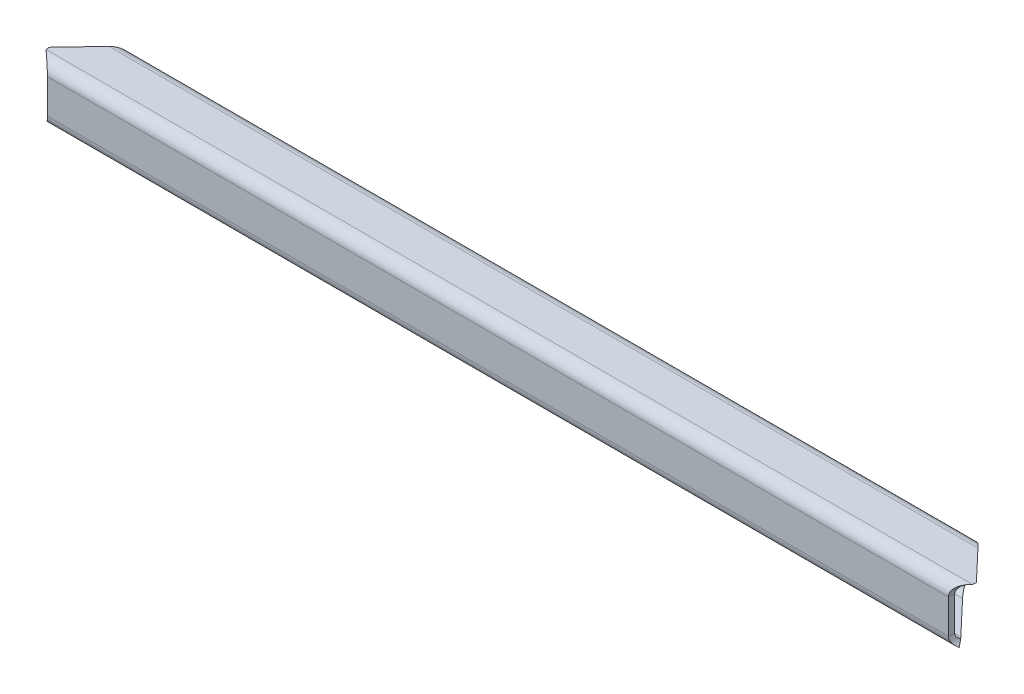
ISO-10303-21;
HEADER;
FILE_DESCRIPTION(('STEP AP214'),'2;1');
FILE_NAME('part.step','',(''),(''),'','','');
FILE_SCHEMA(('AUTOMOTIVE_DESIGN { 1 0 10303 214 1 1 1 1 }'));
ENDSEC;
DATA;
#1=APPLICATION_CONTEXT('core data for automotive mechanical design processes');
#2=APPLICATION_PROTOCOL_DEFINITION('international standard','automotive_design',2000,#1);
#3=PRODUCT_CONTEXT('',#1,'mechanical');
#4=PRODUCT('Part','Part','',(#3));
#5=PRODUCT_RELATED_PRODUCT_CATEGORY('part','',(#4));
#6=PRODUCT_DEFINITION_FORMATION('','',#4);
#7=PRODUCT_DEFINITION_CONTEXT('part definition',#1,'design');
#8=PRODUCT_DEFINITION('design','',#6,#7);
#9=PRODUCT_DEFINITION_SHAPE('','',#8);
#10=(LENGTH_UNIT() NAMED_UNIT(*) SI_UNIT(.MILLI.,.METRE.));
#11=(NAMED_UNIT(*) PLANE_ANGLE_UNIT() SI_UNIT($,.RADIAN.));
#12=(NAMED_UNIT(*) SI_UNIT($,.STERADIAN.) SOLID_ANGLE_UNIT());
#13=UNCERTAINTY_MEASURE_WITH_UNIT(LENGTH_MEASURE(1.E-05),#10,'distance_accuracy_value','');
#14=(GEOMETRIC_REPRESENTATION_CONTEXT(3) GLOBAL_UNCERTAINTY_ASSIGNED_CONTEXT((#13)) GLOBAL_UNIT_ASSIGNED_CONTEXT((#10,
#11,#12)) REPRESENTATION_CONTEXT('',''));
#15=CARTESIAN_POINT('',(0.,0.,0.));
#16=DIRECTION('',(0.,0.,1.));
#17=DIRECTION('',(1.,0.,0.));
#18=AXIS2_PLACEMENT_3D('',#15,#16,#17);
#19=CARTESIAN_POINT('',(-169.428571428572,6.00000000000006,-988.999999999999));
#20=DIRECTION('',(1.,0.,0.));
#21=DIRECTION('',(0.,1.,0.));
#22=AXIS2_PLACEMENT_3D('',#19,#20,#21);
#23=CYLINDRICAL_SURFACE('',#22,2.);
#24=DIRECTION('',(1.,0.,0.));
#25=VECTOR('',#24,1.);
#26=CARTESIAN_POINT('',(-169.428571428572,8.00000000000006,-988.999999999999));
#27=LINE('',#26,#25);
#28=CARTESIAN_POINT('',(-159.217149659244,8.00000000000007,-988.999999999999));
#29=VERTEX_POINT('',#28);
#30=CARTESIAN_POINT('',(159.217149659243,8.,-988.999999999999));
#31=VERTEX_POINT('',#30);
#32=EDGE_CURVE('E214',#29,#31,#27,.T.);
#33=ORIENTED_EDGE('',*,*,#32,.T.);
#34=CARTESIAN_POINT('',(159.217149659243,8.00000000000001,-988.999999999999));
#35=CARTESIAN_POINT('',(159.210922036057,8.00000378393458,-988.945406885648));
#36=CARTESIAN_POINT('',(159.203392434487,7.99776384499151,-988.891001318183));
#37=CARTESIAN_POINT('',(159.185931601539,7.98892816990646,-988.782982141156));
#38=CARTESIAN_POINT('',(159.176002517134,7.98233631861945,-988.729367868822));
#39=CARTESIAN_POINT('',(159.143054453386,7.95634679249622,-988.570939663102));
#40=CARTESIAN_POINT('',(159.116781055866,7.93073112342423,-988.46775974092));
#41=CARTESIAN_POINT('',(159.058106425898,7.86447463934079,-988.268747825726));
#42=CARTESIAN_POINT('',(159.025724912408,7.82388178311721,-988.172893545041));
#43=CARTESIAN_POINT('',(158.957406831272,7.72897970022321,-987.989397197336));
#44=CARTESIAN_POINT('',(158.921463341127,7.67464343298085,-987.901771792465));
#45=CARTESIAN_POINT('',(158.844772257884,7.54683348559491,-987.727108083443));
#46=CARTESIAN_POINT('',(158.803925812453,7.47192488699679,-987.641160157541));
#47=CARTESIAN_POINT('',(158.724640427903,7.30792031092203,-987.482651275367));
#48=CARTESIAN_POINT('',(158.686202065033,7.21882095555204,-987.410093515319));
#49=CARTESIAN_POINT('',(158.6138996549,7.02450247551815,-987.278182494708));
#50=CARTESIAN_POINT('',(158.580241836201,6.91882961331509,-987.219377859785));
#51=CARTESIAN_POINT('',(158.522907915932,6.69643482158755,-987.121261378399));
#52=CARTESIAN_POINT('',(158.499205718591,6.57974277278537,-987.081898522654));
#53=CARTESIAN_POINT('',(158.471261785977,6.38492708419047,-987.035888652455));
#54=CARTESIAN_POINT('',(158.463050361591,6.30890768281359,-987.022498798001));
#55=CARTESIAN_POINT('',(158.451987757356,6.15528943209417,-987.004527352016));
#56=CARTESIAN_POINT('',(158.449148243345,6.07768751437327,-986.999964929974));
#57=CARTESIAN_POINT('',(158.449191454966,6.00000000000002,-986.999999999999));
#58=B_SPLINE_CURVE_WITH_KNOTS('',3,(#34,#35,#36,#37,#38,#39,#40,#41,#42,#43,#44,#45,#46,#47,#48,
#49,#50,#51,#52,#53,#54,#55,#56,#57),.UNSPECIFIED.,.F.,.F.,(4,2,2,2,2,2,2,2,2,2,2,4),(0.,
0.16471101897179,0.329275202545901,0.656079435740069,0.981846157426087,1.3082588897137,
1.67000621123648,2.03183977024398,2.40628968364467,2.77975186590453,3.01197263852517,
3.2446971339819),.UNSPECIFIED.);
#59=CARTESIAN_POINT('',(158.449191454966,6.00000000000001,-986.999999999999));
#60=VERTEX_POINT('',#59);
#61=EDGE_CURVE('E206',#31,#60,#58,.T.);
#62=ORIENTED_EDGE('',*,*,#61,.T.);
#63=DIRECTION('',(1.,0.,0.));
#64=VECTOR('',#63,1.);
#65=CARTESIAN_POINT('',(-169.428571428572,6.00000000000006,-986.999999999999));
#66=LINE('',#65,#64);
#67=CARTESIAN_POINT('',(-158.449191454967,6.00000000000001,-986.999999999999));
#68=VERTEX_POINT('',#67);
#69=EDGE_CURVE('E205',#68,#60,#66,.T.);
#70=ORIENTED_EDGE('',*,*,#69,.F.);
#71=CARTESIAN_POINT('',(-158.449191454967,6.00000000000006,-986.999999999999));
#72=CARTESIAN_POINT('',(-158.449181088276,6.05113742808683,-986.999990535802));
#73=CARTESIAN_POINT('',(-158.450402327418,6.10226783241757,-987.001960976797));
#74=CARTESIAN_POINT('',(-158.455229693472,6.2040912196785,-987.009788260993));
#75=CARTESIAN_POINT('',(-158.458834586163,6.25478441523527,-987.015643092918));
#76=CARTESIAN_POINT('',(-158.468324317597,6.35508084646132,-987.031122228539));
#77=CARTESIAN_POINT('',(-158.474196216591,6.4046886094124,-987.040725142068));
#78=CARTESIAN_POINT('',(-158.488072956633,6.50274559223832,-987.063563989516));
#79=CARTESIAN_POINT('',(-158.496077980952,6.55119471217593,-987.076800235605));
#80=CARTESIAN_POINT('',(-158.523003161242,6.69415310098741,-987.121678123007));
#81=CARTESIAN_POINT('',(-158.544859715153,6.78653658239981,-987.158530525804));
#82=CARTESIAN_POINT('',(-158.594636768432,6.96356396029479,-987.244644739539));
#83=CARTESIAN_POINT('',(-158.622564711204,7.0481981737032,-987.293921794812));
#84=CARTESIAN_POINT('',(-158.684812116677,7.21461903273111,-987.407637146317));
#85=CARTESIAN_POINT('',(-158.719458164608,7.29568444487854,-987.472950777637));
#86=CARTESIAN_POINT('',(-158.790975793571,7.4463160643107,-987.614759188322));
#87=CARTESIAN_POINT('',(-158.827849632759,7.51587032726013,-987.691265428378));
#88=CARTESIAN_POINT('',(-158.906101179419,7.650888326548,-987.865002629685));
#89=CARTESIAN_POINT('',(-158.947428350028,7.71458924226298,-987.963636448079));
#90=CARTESIAN_POINT('',(-159.025631273784,7.82421637946442,-988.171730918346));
#91=CARTESIAN_POINT('',(-159.062515946805,7.87017864109292,-988.281169044241));
#92=CARTESIAN_POINT('',(-159.122781949741,7.93671697031144,-988.490861591138));
#93=CARTESIAN_POINT('',(-159.147375305335,7.9601524851641,-988.589844741756));
#94=CARTESIAN_POINT('',(-159.178288730932,7.98389361504185,-988.741523087992));
#95=CARTESIAN_POINT('',(-159.187614480217,7.98990596963515,-988.792762164494));
#96=CARTESIAN_POINT('',(-159.204073133516,7.99796272194639,-988.895944878289));
#97=CARTESIAN_POINT('',(-159.211204099335,8.00000362091969,-988.947889096268));
#98=CARTESIAN_POINT('',(-159.217149659244,8.00000000000006,-988.999999999999));
#99=B_SPLINE_CURVE_WITH_KNOTS('',3,(#71,#72,#73,#74,#75,#76,#77,#78,#79,#80,#81,#82,#83,#84,#85,
#86,#87,#88,#89,#90,#91,#92,#93,#94,#95,#96,#97,#98),.UNSPECIFIED.,.F.,.F.,(4,2,2,2,2,2,2,2,2,2,
2,2,2,4),(0.,0.153348192858811,0.306617046356498,0.459023697128475,0.611443446464379,
0.915489952029175,1.21991133611073,1.54777651151418,1.87597978577068,2.24766582338126,
2.61859266940544,2.93105522595561,3.08815493067804,3.24539297343133),.UNSPECIFIED.);
#100=EDGE_CURVE('E279',#68,#29,#99,.T.);
#101=ORIENTED_EDGE('',*,*,#100,.T.);
#102=EDGE_LOOP('',(#33,#62,#70,#101));
#103=FACE_BOUND('',#102,.T.);
#104=ADVANCED_FACE('F41',(#103),#23,.F.);
#105=CARTESIAN_POINT('',(-169.428571428572,6.00000000000006,-988.999999999999));
#106=DIRECTION('',(1.,0.,0.));
#107=DIRECTION('',(0.,1.,0.));
#108=AXIS2_PLACEMENT_3D('',#105,#106,#107);
#109=CYLINDRICAL_SURFACE('',#108,4.);
#110=CARTESIAN_POINT('',(162.703800587265,6.00000000000001,-988.999999999999));
#111=DIRECTION('',(0.665752735195008,0.,0.74617243019316));
#112=DIRECTION('',(0.74617243019316,0.,-0.665752735195008));
#113=AXIS2_PLACEMENT_3D('',#110,#111,#112);
#114=ELLIPSE('',#113,6.00823667487953,4.);
#115=CARTESIAN_POINT('',(162.703800587265,10.,-988.999999999999));
#116=VERTEX_POINT('',#115);
#117=CARTESIAN_POINT('',(158.220620026395,6.00000000000001,-984.999999999999));
#118=VERTEX_POINT('',#117);
#119=EDGE_CURVE('E397',#116,#118,#114,.T.);
#120=ORIENTED_EDGE('',*,*,#119,.F.);
#121=DIRECTION('',(1.,0.,0.));
#122=VECTOR('',#121,1.);
#123=CARTESIAN_POINT('',(-169.428571428572,10.0000000000001,-988.999999999999));
#124=LINE('',#123,#122);
#125=CARTESIAN_POINT('',(-162.703800587266,10.,-988.999999999999));
#126=VERTEX_POINT('',#125);
#127=EDGE_CURVE('E230',#126,#116,#124,.T.);
#128=ORIENTED_EDGE('',*,*,#127,.F.);
#129=CARTESIAN_POINT('',(-162.703800587266,6.00000000000003,-988.999999999999));
#130=DIRECTION('',(0.665752735195008,0.,-0.74617243019316));
#131=DIRECTION('',(0.74617243019316,0.,0.665752735195008));
#132=AXIS2_PLACEMENT_3D('',#129,#130,#131);
#133=ELLIPSE('',#132,6.00823667487953,4.);
#134=CARTESIAN_POINT('',(-158.220620026395,6.00000000000001,-984.999999999999));
#135=VERTEX_POINT('',#134);
#136=EDGE_CURVE('E288',#135,#126,#133,.F.);
#137=ORIENTED_EDGE('',*,*,#136,.F.);
#138=DIRECTION('',(1.,0.,0.));
#139=VECTOR('',#138,1.);
#140=CARTESIAN_POINT('',(-169.428571428572,6.00000000000006,-984.999999999999));
#141=LINE('',#140,#139);
#142=EDGE_CURVE('E225',#135,#118,#141,.T.);
#143=ORIENTED_EDGE('',*,*,#142,.T.);
#144=EDGE_LOOP('',(#120,#128,#137,#143));
#145=FACE_BOUND('',#144,.T.);
#146=ADVANCED_FACE('F312',(#145),#109,.T.);
#147=CARTESIAN_POINT('',(-169.428571428572,-5.99999999999995,-988.999999999999));
#148=DIRECTION('',(1.,0.,0.));
#149=DIRECTION('',(0.,1.,0.));
#150=AXIS2_PLACEMENT_3D('',#147,#148,#149);
#151=CYLINDRICAL_SURFACE('',#150,4.);
#152=CARTESIAN_POINT('',(162.703800587265,-6.00000000000001,-988.999999999999));
#153=DIRECTION('',(0.665752735195008,0.,0.74617243019316));
#154=DIRECTION('',(0.74617243019316,0.,-0.665752735195008));
#155=AXIS2_PLACEMENT_3D('',#152,#153,#154);
#156=ELLIPSE('',#155,6.00823667487953,4.);
#157=CARTESIAN_POINT('',(158.220620026395,-6.00000000000001,-984.999999999999));
#158=VERTEX_POINT('',#157);
#159=CARTESIAN_POINT('',(160.266092160077,-9.35700111931669,-986.825018739182));
#160=VERTEX_POINT('',#159);
#161=EDGE_CURVE('E56',#158,#160,#156,.T.);
#162=ORIENTED_EDGE('',*,*,#161,.F.);
#163=DIRECTION('',(1.,0.,0.));
#164=VECTOR('',#163,1.);
#165=CARTESIAN_POINT('',(-169.428571428572,-5.99999999999995,-984.999999999999));
#166=LINE('',#165,#164);
#167=CARTESIAN_POINT('',(-158.220620026395,-6.00000000000001,-984.999999999999));
#168=VERTEX_POINT('',#167);
#169=EDGE_CURVE('E470',#168,#158,#166,.T.);
#170=ORIENTED_EDGE('',*,*,#169,.F.);
#171=CARTESIAN_POINT('',(-162.703800587266,-5.99999999999998,-988.999999999999));
#172=DIRECTION('',(0.665752735195008,0.,-0.74617243019316));
#173=DIRECTION('',(0.74617243019316,0.,0.665752735195008));
#174=AXIS2_PLACEMENT_3D('',#171,#172,#173);
#175=ELLIPSE('',#174,6.00823667487953,4.);
#176=CARTESIAN_POINT('',(-160.266092160077,-9.35700111931662,-986.825018739182));
#177=VERTEX_POINT('',#176);
#178=EDGE_CURVE('E229',#177,#168,#175,.F.);
#179=ORIENTED_EDGE('',*,*,#178,.F.);
#180=CARTESIAN_POINT('',(-159.210703215174,-5.99999999999995,-988.999999999999));
#181=DIRECTION('',(-0.708778209555371,-0.212903658810695,-0.672536602516548));
#182=DIRECTION('',(0.705431392595681,-0.213913749350422,-0.675727354914216));
#183=AXIS2_PLACEMENT_3D('',#180,#181,#182);
#184=ELLIPSE('',#183,5.6435143548068,4.);
#185=CARTESIAN_POINT('',(-158.009178360485,-9.99999999999996,-988.999999999999));
#186=VERTEX_POINT('',#185);
#187=EDGE_CURVE('E446',#186,#177,#184,.T.);
#188=ORIENTED_EDGE('',*,*,#187,.F.);
#189=DIRECTION('',(1.,0.,0.));
#190=VECTOR('',#189,1.);
#191=CARTESIAN_POINT('',(-169.428571428572,-9.99999999999996,-988.999999999999));
#192=LINE('',#191,#190);
#193=CARTESIAN_POINT('',(158.009178360484,-10.,-988.999999999999));
#194=VERTEX_POINT('',#193);
#195=EDGE_CURVE('E246',#186,#194,#192,.T.);
#196=ORIENTED_EDGE('',*,*,#195,.T.);
#197=CARTESIAN_POINT('',(159.210703215174,-6.,-988.999999999999));
#198=DIRECTION('',(0.708778209555372,-0.212903658810694,-0.672536602516547));
#199=DIRECTION('',(0.70543139259568,0.213913749350422,0.675727354914217));
#200=AXIS2_PLACEMENT_3D('',#197,#198,#199);
#201=ELLIPSE('',#200,5.6435143548068,4.);
#202=EDGE_CURVE('E237',#160,#194,#201,.T.);
#203=ORIENTED_EDGE('',*,*,#202,.F.);
#204=EDGE_LOOP('',(#162,#170,#179,#188,#196,#203));
#205=FACE_BOUND('',#204,.T.);
#206=ADVANCED_FACE('F241',(#205),#151,.T.);
#207=CARTESIAN_POINT('',(-169.428571428572,8.00000000000006,-988.999999999999));
#208=DIRECTION('',(0.,-1.,0.));
#209=DIRECTION('',(1.,0.,0.));
#210=AXIS2_PLACEMENT_3D('',#207,#208,#209);
#211=PLANE('',#210);
#212=DIRECTION('',(0.688317522845565,0.,0.725409531053836));
#213=VECTOR('',#212,1.);
#214=CARTESIAN_POINT('',(5.72058318204074,8.00000000000003,-1155.19333916792));
#215=LINE('',#214,#213);
#216=CARTESIAN_POINT('',(152.02963029528,8.00000000000001,-1001.));
#217=VERTEX_POINT('',#216);
#218=CARTESIAN_POINT('',(159.668517535762,8.,-992.949468919542));
#219=VERTEX_POINT('',#218);
#220=EDGE_CURVE('E252',#217,#219,#215,.T.);
#221=ORIENTED_EDGE('',*,*,#220,.T.);
#222=DIRECTION('',(-0.113546591160732,0.,0.993532672656404));
#223=VECTOR('',#222,1.);
#224=CARTESIAN_POINT('',(240.59710582802,8.,-1701.0746164768));
#225=LINE('',#224,#223);
#226=EDGE_CURVE('E11',#219,#31,#225,.T.);
#227=ORIENTED_EDGE('',*,*,#226,.T.);
#228=ORIENTED_EDGE('',*,*,#32,.F.);
#229=DIRECTION('',(0.113546591160732,0.,0.993532672656404));
#230=VECTOR('',#229,1.);
#231=CARTESIAN_POINT('',(-240.597105828021,8.00000000000007,-1701.0746164768));
#232=LINE('',#231,#230);
#233=CARTESIAN_POINT('',(-159.668517535763,8.00000000000006,-992.949468919542));
#234=VERTEX_POINT('',#233);
#235=EDGE_CURVE('E276',#29,#234,#232,.F.);
#236=ORIENTED_EDGE('',*,*,#235,.T.);
#237=DIRECTION('',(0.688317522845566,0.,-0.725409531053835));
#238=VECTOR('',#237,1.);
#239=CARTESIAN_POINT('',(-166.26466333516,8.00000000000006,-985.99787046056));
#240=LINE('',#239,#238);
#241=CARTESIAN_POINT('',(-152.02963029528,8.00000000000006,-1001.));
#242=VERTEX_POINT('',#241);
#243=EDGE_CURVE('E453',#234,#242,#240,.T.);
#244=ORIENTED_EDGE('',*,*,#243,.T.);
#245=DIRECTION('',(1.,0.,0.));
#246=VECTOR('',#245,1.);
#247=CARTESIAN_POINT('',(-169.428571428572,8.00000000000006,-1001.));
#248=LINE('',#247,#246);
#249=EDGE_CURVE('E223',#242,#217,#248,.T.);
#250=ORIENTED_EDGE('',*,*,#249,.T.);
#251=EDGE_LOOP('',(#221,#227,#228,#236,#244,#250));
#252=FACE_BOUND('',#251,.T.);
#253=ADVANCED_FACE('F311',(#252),#211,.T.);
#254=CARTESIAN_POINT('',(-169.428571428572,-5.99999999999995,-988.999999999999));
#255=DIRECTION('',(1.,0.,0.));
#256=DIRECTION('',(0.,1.,0.));
#257=AXIS2_PLACEMENT_3D('',#254,#255,#256);
#258=CYLINDRICAL_SURFACE('',#257,2.);
#259=DIRECTION('',(1.,0.,0.));
#260=VECTOR('',#259,1.);
#261=CARTESIAN_POINT('',(-169.428571428572,-5.99999999999995,-986.999999999999));
#262=LINE('',#261,#260);
#263=CARTESIAN_POINT('',(-158.449191454967,-6.00000000000001,-986.999999999999));
#264=VERTEX_POINT('',#263);
#265=CARTESIAN_POINT('',(158.449191454966,-6.00000000000001,-986.999999999999));
#266=VERTEX_POINT('',#265);
#267=EDGE_CURVE('E203',#264,#266,#262,.T.);
#268=ORIENTED_EDGE('',*,*,#267,.T.);
#269=CARTESIAN_POINT('',(158.449191454966,-6.,-986.999999999999));
#270=CARTESIAN_POINT('',(158.449181088276,-6.05113742808677,-986.999990535802));
#271=CARTESIAN_POINT('',(158.450402327418,-6.10226783241751,-987.001960976797));
#272=CARTESIAN_POINT('',(158.455229693472,-6.20409121967844,-987.009788260993));
#273=CARTESIAN_POINT('',(158.458834586163,-6.2547844152352,-987.015643092918));
#274=CARTESIAN_POINT('',(158.468324317596,-6.35508084646126,-987.031122228539));
#275=CARTESIAN_POINT('',(158.474196216591,-6.40468860941234,-987.040725142068));
#276=CARTESIAN_POINT('',(158.488072956632,-6.50274559223825,-987.063563989516));
#277=CARTESIAN_POINT('',(158.496077980952,-6.55119471217587,-987.076800235605));
#278=CARTESIAN_POINT('',(158.523003161242,-6.69415310098735,-987.121678123007));
#279=CARTESIAN_POINT('',(158.544859715153,-6.78653658239976,-987.158530525804));
#280=CARTESIAN_POINT('',(158.594636768432,-6.96356396029473,-987.244644739539));
#281=CARTESIAN_POINT('',(158.622564711203,-7.04819817370313,-987.293921794812));
#282=CARTESIAN_POINT('',(158.684812116677,-7.21461903273104,-987.407637146317));
#283=CARTESIAN_POINT('',(158.719458164608,-7.29568444487849,-987.472950777637));
#284=CARTESIAN_POINT('',(158.790975793571,-7.44631606431064,-987.614759188321));
#285=CARTESIAN_POINT('',(158.827849632759,-7.51587032726003,-987.691265428378));
#286=CARTESIAN_POINT('',(158.906101179418,-7.65088832654791,-987.865002629685));
#287=CARTESIAN_POINT('',(158.947428350028,-7.71458924226295,-987.963636448079));
#288=CARTESIAN_POINT('',(159.025631273784,-7.82421637946441,-988.171730918347));
#289=CARTESIAN_POINT('',(159.062515946805,-7.87017864109288,-988.281169044241));
#290=CARTESIAN_POINT('',(159.12278194974,-7.93671697031138,-988.490861591138));
#291=CARTESIAN_POINT('',(159.147375305335,-7.96015248516403,-988.589844741756));
#292=CARTESIAN_POINT('',(159.178288730932,-7.98389361504178,-988.741523087992));
#293=CARTESIAN_POINT('',(159.187614480216,-7.98990596963509,-988.792762164494));
#294=CARTESIAN_POINT('',(159.204073133515,-7.99796272194633,-988.895944878288));
#295=CARTESIAN_POINT('',(159.211204099334,-8.00000362091964,-988.947889096268));
#296=CARTESIAN_POINT('',(159.217149659243,-8.00000000000001,-988.999999999999));
#297=B_SPLINE_CURVE_WITH_KNOTS('',3,(#269,#270,#271,#272,#273,#274,#275,#276,#277,#278,#279,
#280,#281,#282,#283,#284,#285,#286,#287,#288,#289,#290,#291,#292,#293,#294,#295,#296),
.UNSPECIFIED.,.F.,.F.,(4,2,2,2,2,2,2,2,2,2,2,2,2,4),(0.,0.153348192858805,0.306617046356487,
0.459023697128464,0.611443446464375,0.915489952029179,1.21991133611072,1.5477765115141,
1.87597978577063,2.24766582338138,2.61859266940543,2.93105522595549,3.08815493067792,
3.24539297343121),.UNSPECIFIED.);
#298=CARTESIAN_POINT('',(159.119747295865,-7.93232822804912,-988.484143799993));
#299=VERTEX_POINT('',#298);
#300=EDGE_CURVE('E179',#266,#299,#297,.T.);
#301=ORIENTED_EDGE('',*,*,#300,.T.);
#302=CARTESIAN_POINT('',(159.210703215174,-6.,-988.999999999999));
#303=DIRECTION('',(0.708778209555372,-0.212903658810694,-0.672536602516547));
#304=DIRECTION('',(0.70543139259568,0.213913749350422,0.675727354914217));
#305=AXIS2_PLACEMENT_3D('',#302,#303,#304);
#306=ELLIPSE('',#305,2.8217571774034,2.);
#307=CARTESIAN_POINT('',(158.609940787829,-8.,-988.999999999999));
#308=VERTEX_POINT('',#307);
#309=EDGE_CURVE('E239',#299,#308,#306,.T.);
#310=ORIENTED_EDGE('',*,*,#309,.T.);
#311=DIRECTION('',(1.,0.,0.));
#312=VECTOR('',#311,1.);
#313=CARTESIAN_POINT('',(-169.428571428572,-7.99999999999995,-988.999999999999));
#314=LINE('',#313,#312);
#315=CARTESIAN_POINT('',(-158.609940787829,-7.99999999999995,-988.999999999999));
#316=VERTEX_POINT('',#315);
#317=EDGE_CURVE('E212',#316,#308,#314,.T.);
#318=ORIENTED_EDGE('',*,*,#317,.F.);
#319=CARTESIAN_POINT('',(-159.210703215174,-5.99999999999995,-988.999999999999));
#320=DIRECTION('',(-0.708778209555371,-0.212903658810695,-0.672536602516548));
#321=DIRECTION('',(0.705431392595681,-0.213913749350422,-0.675727354914216));
#322=AXIS2_PLACEMENT_3D('',#319,#320,#321);
#323=ELLIPSE('',#322,2.8217571774034,2.);
#324=CARTESIAN_POINT('',(-159.119747295866,-7.93232822804906,-988.484143799993));
#325=VERTEX_POINT('',#324);
#326=EDGE_CURVE('E442',#316,#325,#323,.T.);
#327=ORIENTED_EDGE('',*,*,#326,.T.);
#328=CARTESIAN_POINT('',(-159.217149659243,-7.99999999999996,-988.999999999999));
#329=CARTESIAN_POINT('',(-159.210922036058,-8.00000378393452,-988.945406885648));
#330=CARTESIAN_POINT('',(-159.203392434487,-7.99776384499145,-988.891001318183));
#331=CARTESIAN_POINT('',(-159.18593160154,-7.98892816990639,-988.782982141156));
#332=CARTESIAN_POINT('',(-159.176002517134,-7.98233631861938,-988.729367868822));
#333=CARTESIAN_POINT('',(-159.143054453387,-7.95634679249614,-988.570939663102));
#334=CARTESIAN_POINT('',(-159.116781055866,-7.93073112342415,-988.46775974092));
#335=CARTESIAN_POINT('',(-159.058106425898,-7.86447463934071,-988.268747825726));
#336=CARTESIAN_POINT('',(-159.025724912408,-7.82388178311714,-988.17289354504));
#337=CARTESIAN_POINT('',(-158.957406831272,-7.72897970022314,-987.989397197336));
#338=CARTESIAN_POINT('',(-158.921463341127,-7.67464343298075,-987.901771792465));
#339=CARTESIAN_POINT('',(-158.844772257884,-7.54683348559479,-987.727108083443));
#340=CARTESIAN_POINT('',(-158.803925812454,-7.47192488699667,-987.641160157541));
#341=CARTESIAN_POINT('',(-158.724640427903,-7.3079203109219,-987.482651275367));
#342=CARTESIAN_POINT('',(-158.686202065033,-7.21882095555189,-987.410093515319));
#343=CARTESIAN_POINT('',(-158.6138996549,-7.02450247551799,-987.278182494708));
#344=CARTESIAN_POINT('',(-158.580241836201,-6.91882961331495,-987.219377859785));
#345=CARTESIAN_POINT('',(-158.522907915932,-6.69643482158741,-987.121261378399));
#346=CARTESIAN_POINT('',(-158.499205718591,-6.57974277278519,-987.081898522654));
#347=CARTESIAN_POINT('',(-158.471261785978,-6.38492708419029,-987.035888652455));
#348=CARTESIAN_POINT('',(-158.463050361591,-6.30890768281345,-987.022498798001));
#349=CARTESIAN_POINT('',(-158.451987757356,-6.15528943209409,-987.004527352016));
#350=CARTESIAN_POINT('',(-158.449148243345,-6.07768751437322,-986.999964929974));
#351=CARTESIAN_POINT('',(-158.449191454967,-6.00000000000001,-986.999999999999));
#352=B_SPLINE_CURVE_WITH_KNOTS('',3,(#328,#329,#330,#331,#332,#333,#334,#335,#336,#337,#338,
#339,#340,#341,#342,#343,#344,#345,#346,#347,#348,#349,#350,#351),.UNSPECIFIED.,.F.,.F.,(4,2,2,
2,2,2,2,2,2,2,2,4),(0.,0.16471101897192,0.329275202545922,0.656079435740094,0.981846157426003,
1.30825888971375,1.67000621123642,2.03183977024397,2.40628968364461,2.77975186590455,
3.0119726385251,3.24469713398173),.UNSPECIFIED.);
#353=EDGE_CURVE('E211',#325,#264,#352,.T.);
#354=ORIENTED_EDGE('',*,*,#353,.T.);
#355=EDGE_LOOP('',(#268,#301,#310,#318,#327,#354));
#356=FACE_BOUND('',#355,.T.);
#357=ADVANCED_FACE('F209',(#356),#258,.F.);
#358=CARTESIAN_POINT('',(-244.038803964062,-6.00000000000001,-1700.68127954697));
#359=DIRECTION('',(0.113546591160732,0.,0.993532672656404));
#360=DIRECTION('',(0.993532672656404,0.,-0.113546591160732));
#361=AXIS2_PLACEMENT_3D('',#358,#359,#360);
#362=CYLINDRICAL_SURFACE('',#361,4.);
#363=CARTESIAN_POINT('',(-162.328303315894,-6.00000000000001,-985.714398875496));
#364=DIRECTION('',(-0.708778209555371,-0.212903658810695,-0.672536602516548));
#365=DIRECTION('',(-0.629148245586715,-0.240432271061151,0.739164939717473));
#366=AXIS2_PLACEMENT_3D('',#363,#364,#365);
#367=ELLIPSE('',#366,5.34283333451752,4.);
#368=EDGE_CURVE('E445',#177,#325,#367,.F.);
#369=ORIENTED_EDGE('',*,*,#368,.F.);
#370=ORIENTED_EDGE('',*,*,#178,.T.);
#371=DIRECTION('',(0.113546591160732,0.,0.993532672656404));
#372=VECTOR('',#371,1.);
#373=CARTESIAN_POINT('',(-240.064673273436,-6.00000000000001,-1701.13546591161));
#374=LINE('',#373,#372);
#375=EDGE_CURVE('E267',#264,#168,#374,.T.);
#376=ORIENTED_EDGE('',*,*,#375,.F.);
#377=ORIENTED_EDGE('',*,*,#353,.F.);
#378=EDGE_LOOP('',(#369,#370,#376,#377));
#379=FACE_BOUND('',#378,.T.);
#380=ADVANCED_FACE('F350',(#379),#362,.F.);
#381=CARTESIAN_POINT('',(-240.064673273436,-6.00000000000001,-1701.13546591161));
#382=DIRECTION('',(-0.993532672656404,0.,0.113546591160732));
#383=DIRECTION('',(0.113546591160732,0.,0.993532672656404));
#384=AXIS2_PLACEMENT_3D('',#381,#382,#383);
#385=PLANE('',#384);
#386=DIRECTION('',(0.,1.,0.));
#387=VECTOR('',#386,1.);
#388=CARTESIAN_POINT('',(-158.220620026395,6.00000000000006,-984.999999999999));
#389=LINE('',#388,#387);
#390=EDGE_CURVE('E486',#168,#135,#389,.T.);
#391=ORIENTED_EDGE('',*,*,#390,.T.);
#392=DIRECTION('',(0.113546591160732,0.,0.993532672656404));
#393=VECTOR('',#392,1.);
#394=CARTESIAN_POINT('',(-240.064673273436,6.00000000000001,-1701.13546591161));
#395=LINE('',#394,#393);
#396=EDGE_CURVE('E270',#68,#135,#395,.T.);
#397=ORIENTED_EDGE('',*,*,#396,.F.);
#398=DIRECTION('',(0.,1.,0.));
#399=VECTOR('',#398,1.);
#400=CARTESIAN_POINT('',(-158.449191454967,6.00000000000006,-986.999999999999));
#401=LINE('',#400,#399);
#402=EDGE_CURVE('E485',#264,#68,#401,.T.);
#403=ORIENTED_EDGE('',*,*,#402,.F.);
#404=ORIENTED_EDGE('',*,*,#375,.T.);
#405=EDGE_LOOP('',(#391,#397,#403,#404));
#406=FACE_BOUND('',#405,.T.);
#407=ADVANCED_FACE('F300',(#406),#385,.T.);
#408=CARTESIAN_POINT('',(-161.063367380154,7.19515108731862,-991.224663980651));
#409=DIRECTION('',(-0.708778209555371,-0.212903658810695,-0.672536602516548));
#410=DIRECTION('',(-0.688317522845566,0.,0.725409531053835));
#411=AXIS2_PLACEMENT_3D('',#408,#409,#410);
#412=PLANE('',#411);
#413=DIRECTION('',(0.287682820424566,-0.957725740926162,0.));
#414=VECTOR('',#413,1.);
#415=CARTESIAN_POINT('',(-146.130942176686,0.998170150367917,-1005.));
#416=LINE('',#415,#414);
#417=CARTESIAN_POINT('',(-147.6333978975,6.00000000000006,-1005.));
#418=VERTEX_POINT('',#417);
#419=CARTESIAN_POINT('',(-144.028823333433,-5.99999999999996,-1005.));
#420=VERTEX_POINT('',#419);
#421=EDGE_CURVE('E419',#418,#420,#416,.T.);
#422=ORIENTED_EDGE('',*,*,#421,.T.);
#423=CARTESIAN_POINT('',(-147.824293303868,-5.99999999999996,-1001.));
#424=DIRECTION('',(-0.708778209555371,-0.212903658810695,-0.672536602516548));
#425=DIRECTION('',(0.705431392595681,-0.213913749350422,-0.675727354914216));
#426=AXIS2_PLACEMENT_3D('',#423,#424,#425);
#427=ELLIPSE('',#426,5.6435143548068,4.);
#428=CARTESIAN_POINT('',(-146.622768449179,-9.99999999999996,-1001.));
#429=VERTEX_POINT('',#428);
#430=EDGE_CURVE('E465',#420,#429,#427,.T.);
#431=ORIENTED_EDGE('',*,*,#430,.T.);
#432=DIRECTION('',(-0.688317522845566,0.,0.725409531053835));
#433=VECTOR('',#432,1.);
#434=CARTESIAN_POINT('',(-157.427724870072,-9.99999999999996,-989.612786816853));
#435=LINE('',#434,#433);
#436=EDGE_CURVE('E463',#429,#186,#435,.T.);
#437=ORIENTED_EDGE('',*,*,#436,.T.);
#438=ORIENTED_EDGE('',*,*,#187,.T.);
#439=ORIENTED_EDGE('',*,*,#368,.T.);
#440=ORIENTED_EDGE('',*,*,#326,.F.);
#441=DIRECTION('',(-0.688317522845566,0.,0.725409531053835));
#442=VECTOR('',#441,1.);
#443=CARTESIAN_POINT('',(-157.743857466464,-7.99999999999995,-989.912754760924));
#444=LINE('',#443,#442);
#445=CARTESIAN_POINT('',(-147.223530876524,-7.99999999999996,-1001.));
#446=VERTEX_POINT('',#445);
#447=EDGE_CURVE('E439',#446,#316,#444,.T.);
#448=ORIENTED_EDGE('',*,*,#447,.F.);
#449=CARTESIAN_POINT('',(-147.824293303868,-5.99999999999996,-1001.));
#450=DIRECTION('',(-0.708778209555371,-0.212903658810695,-0.672536602516548));
#451=DIRECTION('',(0.705431392595681,-0.213913749350422,-0.675727354914216));
#452=AXIS2_PLACEMENT_3D('',#449,#450,#451);
#453=ELLIPSE('',#452,2.8217571774034,2.);
#454=CARTESIAN_POINT('',(-145.926558318651,-6.00000000000001,-1003.));
#455=VERTEX_POINT('',#454);
#456=EDGE_CURVE('E438',#455,#446,#453,.T.);
#457=ORIENTED_EDGE('',*,*,#456,.F.);
#458=DIRECTION('',(0.287682820424566,-0.957725740926162,0.));
#459=VECTOR('',#458,1.);
#460=CARTESIAN_POINT('',(-147.871617947891,0.47530384960329,-1003.));
#461=LINE('',#460,#459);
#462=CARTESIAN_POINT('',(-149.531132882718,6.00000000000006,-1003.));
#463=VERTEX_POINT('',#462);
#464=EDGE_CURVE('E458',#463,#455,#461,.T.);
#465=ORIENTED_EDGE('',*,*,#464,.F.);
#466=CARTESIAN_POINT('',(-151.428867867936,6.00000000000006,-1001.));
#467=DIRECTION('',(-0.708778209555371,-0.212903658810695,-0.672536602516548));
#468=DIRECTION('',(0.705431392595681,-0.213913749350422,-0.675727354914216));
#469=AXIS2_PLACEMENT_3D('',#466,#467,#468);
#470=ELLIPSE('',#469,2.8217571774034,2.);
#471=EDGE_CURVE('E455',#242,#463,#470,.T.);
#472=ORIENTED_EDGE('',*,*,#471,.F.);
#473=ORIENTED_EDGE('',*,*,#243,.F.);
#474=CARTESIAN_POINT('',(-162.715784044051,6.00000000000001,-989.104855246875));
#475=DIRECTION('',(-0.708778209555371,-0.212903658810695,-0.672536602516548));
#476=DIRECTION('',(-0.629148245586715,-0.240432271061151,0.739164939717473));
#477=AXIS2_PLACEMENT_3D('',#474,#475,#476);
#478=ELLIPSE('',#477,5.34283333451752,4.);
#479=CARTESIAN_POINT('',(-162.844944286771,10.,-990.235007370667));
#480=VERTEX_POINT('',#479);
#481=EDGE_CURVE('E226',#234,#480,#478,.F.);
#482=ORIENTED_EDGE('',*,*,#481,.T.);
#483=DIRECTION('',(0.688317522845566,0.,-0.725409531053835));
#484=VECTOR('',#483,1.);
#485=CARTESIAN_POINT('',(-166.580795931552,10.0000000000001,-986.29783840463));
#486=LINE('',#485,#484);
#487=CARTESIAN_POINT('',(-152.630392722625,10.0000000000001,-1001.));
#488=VERTEX_POINT('',#487);
#489=EDGE_CURVE('E451',#480,#488,#486,.T.);
#490=ORIENTED_EDGE('',*,*,#489,.T.);
#491=CARTESIAN_POINT('',(-151.428867867936,6.00000000000006,-1001.));
#492=DIRECTION('',(-0.708778209555371,-0.212903658810695,-0.672536602516548));
#493=DIRECTION('',(0.705431392595681,-0.213913749350422,-0.675727354914216));
#494=AXIS2_PLACEMENT_3D('',#491,#492,#493);
#495=ELLIPSE('',#494,5.6435143548068,4.);
#496=EDGE_CURVE('E447',#488,#418,#495,.T.);
#497=ORIENTED_EDGE('',*,*,#496,.T.);
#498=EDGE_LOOP('',(#422,#431,#437,#438,#439,#440,#448,#457,#465,#472,#473,#482,#490,#497));
#499=FACE_BOUND('',#498,.T.);
#500=ADVANCED_FACE('F298',(#499),#412,.T.);
#501=CARTESIAN_POINT('',(-244.038803964062,6.00000000000001,-1700.68127954697));
#502=DIRECTION('',(0.113546591160732,0.,0.993532672656404));
#503=DIRECTION('',(0.993532672656404,0.,-0.113546591160732));
#504=AXIS2_PLACEMENT_3D('',#501,#502,#503);
#505=CYLINDRICAL_SURFACE('',#504,4.);
#506=ORIENTED_EDGE('',*,*,#136,.T.);
#507=DIRECTION('',(0.113546591160732,0.,0.993532672656404));
#508=VECTOR('',#507,1.);
#509=CARTESIAN_POINT('',(-244.038803964062,10.,-1700.68127954697));
#510=LINE('',#509,#508);
#511=EDGE_CURVE('E273',#480,#126,#510,.T.);
#512=ORIENTED_EDGE('',*,*,#511,.F.);
#513=ORIENTED_EDGE('',*,*,#481,.F.);
#514=ORIENTED_EDGE('',*,*,#235,.F.);
#515=ORIENTED_EDGE('',*,*,#100,.F.);
#516=ORIENTED_EDGE('',*,*,#396,.T.);
#517=EDGE_LOOP('',(#506,#512,#513,#514,#515,#516));
#518=FACE_BOUND('',#517,.T.);
#519=ADVANCED_FACE('F292',(#518),#505,.F.);
#520=CARTESIAN_POINT('',(-169.428571428572,-5.99999999999995,-1001.));
#521=DIRECTION('',(1.,0.,0.));
#522=DIRECTION('',(0.,1.,0.));
#523=AXIS2_PLACEMENT_3D('',#520,#521,#522);
#524=CYLINDRICAL_SURFACE('',#523,2.);
#525=DIRECTION('',(1.,0.,0.));
#526=VECTOR('',#525,1.);
#527=CARTESIAN_POINT('',(-169.428571428572,-7.99999999999995,-1001.));
#528=LINE('',#527,#526);
#529=CARTESIAN_POINT('',(147.223530876524,-8.,-1001.));
#530=VERTEX_POINT('',#529);
#531=EDGE_CURVE('E217',#446,#530,#528,.T.);
#532=ORIENTED_EDGE('',*,*,#531,.T.);
#533=CARTESIAN_POINT('',(147.824293303868,-6.,-1001.));
#534=DIRECTION('',(0.708778209555372,-0.212903658810694,-0.672536602516547));
#535=DIRECTION('',(0.70543139259568,0.213913749350422,0.675727354914217));
#536=AXIS2_PLACEMENT_3D('',#533,#534,#535);
#537=ELLIPSE('',#536,2.8217571774034,2.);
#538=CARTESIAN_POINT('',(145.92655831865,-6.00000000000027,-1003.));
#539=VERTEX_POINT('',#538);
#540=EDGE_CURVE('E261',#530,#539,#537,.T.);
#541=ORIENTED_EDGE('',*,*,#540,.T.);
#542=DIRECTION('',(1.,0.,0.));
#543=VECTOR('',#542,1.);
#544=CARTESIAN_POINT('',(-169.428571428572,-5.99999999999995,-1003.));
#545=LINE('',#544,#543);
#546=EDGE_CURVE('E432',#455,#539,#545,.T.);
#547=ORIENTED_EDGE('',*,*,#546,.F.);
#548=ORIENTED_EDGE('',*,*,#456,.T.);
#549=EDGE_LOOP('',(#532,#541,#547,#548));
#550=FACE_BOUND('',#549,.T.);
#551=ADVANCED_FACE('F297',(#550),#524,.F.);
#552=CARTESIAN_POINT('',(-169.428571428572,-5.99999999999995,-1001.));
#553=DIRECTION('',(1.,0.,0.));
#554=DIRECTION('',(0.,1.,0.));
#555=AXIS2_PLACEMENT_3D('',#552,#553,#554);
#556=CYLINDRICAL_SURFACE('',#555,4.);
#557=CARTESIAN_POINT('',(147.824293303868,-6.,-1001.));
#558=DIRECTION('',(0.708778209555372,-0.212903658810694,-0.672536602516547));
#559=DIRECTION('',(0.70543139259568,0.213913749350422,0.675727354914217));
#560=AXIS2_PLACEMENT_3D('',#557,#558,#559);
#561=ELLIPSE('',#560,5.6435143548068,4.);
#562=CARTESIAN_POINT('',(146.622768449179,-10.,-1001.));
#563=VERTEX_POINT('',#562);
#564=CARTESIAN_POINT('',(144.028823333433,-6.00000000000027,-1005.));
#565=VERTEX_POINT('',#564);
#566=EDGE_CURVE('E249',#563,#565,#561,.T.);
#567=ORIENTED_EDGE('',*,*,#566,.F.);
#568=DIRECTION('',(1.,0.,0.));
#569=VECTOR('',#568,1.);
#570=CARTESIAN_POINT('',(-169.428571428572,-9.99999999999996,-1001.));
#571=LINE('',#570,#569);
#572=EDGE_CURVE('E424',#429,#563,#571,.T.);
#573=ORIENTED_EDGE('',*,*,#572,.F.);
#574=ORIENTED_EDGE('',*,*,#430,.F.);
#575=DIRECTION('',(1.,0.,0.));
#576=VECTOR('',#575,1.);
#577=CARTESIAN_POINT('',(-169.428571428572,-5.99999999999995,-1005.));
#578=LINE('',#577,#576);
#579=EDGE_CURVE('E421',#420,#565,#578,.T.);
#580=ORIENTED_EDGE('',*,*,#579,.T.);
#581=EDGE_LOOP('',(#567,#573,#574,#580));
#582=FACE_BOUND('',#581,.T.);
#583=ADVANCED_FACE('F319',(#582),#556,.T.);
#584=CARTESIAN_POINT('',(-169.428571428572,6.00000000000006,-986.999999999999));
#585=DIRECTION('',(0.,0.,-1.));
#586=DIRECTION('',(-1.,0.,0.));
#587=AXIS2_PLACEMENT_3D('',#584,#585,#586);
#588=PLANE('',#587);
#589=ORIENTED_EDGE('',*,*,#69,.T.);
#590=DIRECTION('',(0.,-1.,0.));
#591=VECTOR('',#590,1.);
#592=CARTESIAN_POINT('',(158.449191454966,6.00000000000006,-986.999999999999));
#593=LINE('',#592,#591);
#594=EDGE_CURVE('E192',#60,#266,#593,.T.);
#595=ORIENTED_EDGE('',*,*,#594,.T.);
#596=ORIENTED_EDGE('',*,*,#267,.F.);
#597=ORIENTED_EDGE('',*,*,#402,.T.);
#598=EDGE_LOOP('',(#589,#595,#596,#597));
#599=FACE_BOUND('',#598,.T.);
#600=ADVANCED_FACE('F201',(#599),#588,.T.);
#601=CARTESIAN_POINT('',(-169.428571428572,6.00000000000006,-984.999999999999));
#602=DIRECTION('',(0.,0.,-1.));
#603=DIRECTION('',(-1.,0.,0.));
#604=AXIS2_PLACEMENT_3D('',#601,#602,#603);
#605=PLANE('',#604);
#606=DIRECTION('',(0.,-1.,0.));
#607=VECTOR('',#606,1.);
#608=CARTESIAN_POINT('',(158.220620026395,6.00000000000006,-984.999999999999));
#609=LINE('',#608,#607);
#610=EDGE_CURVE('E195',#118,#158,#609,.T.);
#611=ORIENTED_EDGE('',*,*,#610,.F.);
#612=ORIENTED_EDGE('',*,*,#142,.F.);
#613=ORIENTED_EDGE('',*,*,#390,.F.);
#614=ORIENTED_EDGE('',*,*,#169,.T.);
#615=EDGE_LOOP('',(#611,#612,#613,#614));
#616=FACE_BOUND('',#615,.T.);
#617=ADVANCED_FACE('F305',(#616),#605,.F.);
#618=CARTESIAN_POINT('',(-169.428571428572,6.00000000000006,-1001.));
#619=DIRECTION('',(1.,0.,0.));
#620=DIRECTION('',(0.,1.,0.));
#621=AXIS2_PLACEMENT_3D('',#618,#619,#620);
#622=CYLINDRICAL_SURFACE('',#621,2.);
#623=DIRECTION('',(1.,0.,0.));
#624=VECTOR('',#623,1.);
#625=CARTESIAN_POINT('',(-169.428571428572,6.00000000000006,-1003.));
#626=LINE('',#625,#624);
#627=CARTESIAN_POINT('',(149.531132882718,6.00000000000001,-1003.));
#628=VERTEX_POINT('',#627);
#629=EDGE_CURVE('E430',#463,#628,#626,.T.);
#630=ORIENTED_EDGE('',*,*,#629,.T.);
#631=CARTESIAN_POINT('',(151.428867867935,6.00000000000001,-1001.));
#632=DIRECTION('',(0.708778209555372,-0.212903658810694,-0.672536602516547));
#633=DIRECTION('',(0.70543139259568,0.213913749350422,0.675727354914217));
#634=AXIS2_PLACEMENT_3D('',#631,#632,#633);
#635=ELLIPSE('',#634,2.8217571774034,2.);
#636=EDGE_CURVE('E64',#628,#217,#635,.T.);
#637=ORIENTED_EDGE('',*,*,#636,.T.);
#638=ORIENTED_EDGE('',*,*,#249,.F.);
#639=ORIENTED_EDGE('',*,*,#471,.T.);
#640=EDGE_LOOP('',(#630,#637,#638,#639));
#641=FACE_BOUND('',#640,.T.);
#642=ADVANCED_FACE('F43',(#641),#622,.F.);
#643=CARTESIAN_POINT('',(-169.428571428572,10.0000000000001,-988.999999999999));
#644=DIRECTION('',(0.,-1.,0.));
#645=DIRECTION('',(1.,0.,0.));
#646=AXIS2_PLACEMENT_3D('',#643,#644,#645);
#647=PLANE('',#646);
#648=ORIENTED_EDGE('',*,*,#127,.T.);
#649=DIRECTION('',(-0.113546591160732,0.,0.993532672656404));
#650=VECTOR('',#649,1.);
#651=CARTESIAN_POINT('',(244.038803964062,10.,-1700.68127954696));
#652=LINE('',#651,#650);
#653=CARTESIAN_POINT('',(162.84494428677,10.,-990.235007370667));
#654=VERTEX_POINT('',#653);
#655=EDGE_CURVE('E478',#654,#116,#652,.T.);
#656=ORIENTED_EDGE('',*,*,#655,.F.);
#657=DIRECTION('',(0.688317522845565,0.,0.725409531053836));
#658=VECTOR('',#657,1.);
#659=CARTESIAN_POINT('',(6.03671577843246,10.,-1155.49330711199));
#660=LINE('',#659,#658);
#661=CARTESIAN_POINT('',(152.630392722624,10.,-1001.));
#662=VERTEX_POINT('',#661);
#663=EDGE_CURVE('E247',#662,#654,#660,.T.);
#664=ORIENTED_EDGE('',*,*,#663,.F.);
#665=DIRECTION('',(1.,0.,0.));
#666=VECTOR('',#665,1.);
#667=CARTESIAN_POINT('',(-169.428571428572,10.0000000000001,-1001.));
#668=LINE('',#667,#666);
#669=EDGE_CURVE('E416',#488,#662,#668,.T.);
#670=ORIENTED_EDGE('',*,*,#669,.F.);
#671=ORIENTED_EDGE('',*,*,#489,.F.);
#672=ORIENTED_EDGE('',*,*,#511,.T.);
#673=EDGE_LOOP('',(#648,#656,#664,#670,#671,#672));
#674=FACE_BOUND('',#673,.T.);
#675=ADVANCED_FACE('F330',(#674),#647,.F.);
#676=CARTESIAN_POINT('',(-169.428571428572,6.00000000000006,-1001.));
#677=DIRECTION('',(1.,0.,0.));
#678=DIRECTION('',(0.,1.,0.));
#679=AXIS2_PLACEMENT_3D('',#676,#677,#678);
#680=CYLINDRICAL_SURFACE('',#679,4.);
#681=CARTESIAN_POINT('',(151.428867867935,6.00000000000001,-1001.));
#682=DIRECTION('',(0.708778209555372,-0.212903658810694,-0.672536602516547));
#683=DIRECTION('',(0.70543139259568,0.213913749350422,0.675727354914217));
#684=AXIS2_PLACEMENT_3D('',#681,#682,#683);
#685=ELLIPSE('',#684,5.6435143548068,4.);
#686=CARTESIAN_POINT('',(147.6333978975,6.00000000000001,-1005.));
#687=VERTEX_POINT('',#686);
#688=EDGE_CURVE('E399',#687,#662,#685,.T.);
#689=ORIENTED_EDGE('',*,*,#688,.F.);
#690=DIRECTION('',(1.,0.,0.));
#691=VECTOR('',#690,1.);
#692=CARTESIAN_POINT('',(-169.428571428572,6.00000000000006,-1005.));
#693=LINE('',#692,#691);
#694=EDGE_CURVE('E414',#418,#687,#693,.T.);
#695=ORIENTED_EDGE('',*,*,#694,.F.);
#696=ORIENTED_EDGE('',*,*,#496,.F.);
#697=ORIENTED_EDGE('',*,*,#669,.T.);
#698=EDGE_LOOP('',(#689,#695,#696,#697));
#699=FACE_BOUND('',#698,.T.);
#700=ADVANCED_FACE('F327',(#699),#680,.T.);
#701=CARTESIAN_POINT('',(163.618211285882,-2.9370779111048,-985.324603969017));
#702=DIRECTION('',(0.708778209555372,-0.212903658810694,-0.672536602516547));
#703=DIRECTION('',(-0.688317522845565,0.,-0.725409531053836));
#704=AXIS2_PLACEMENT_3D('',#701,#702,#703);
#705=PLANE('',#704);
#706=DIRECTION('',(-0.688317522845565,0.,-0.725409531053836));
#707=VECTOR('',#706,1.);
#708=CARTESIAN_POINT('',(-2.80022268665542,-7.99999999999998,-1159.10822346828));
#709=LINE('',#708,#707);
#710=EDGE_CURVE('E264',#308,#530,#709,.T.);
#711=ORIENTED_EDGE('',*,*,#710,.F.);
#712=ORIENTED_EDGE('',*,*,#309,.F.);
#713=CARTESIAN_POINT('',(162.328303315894,-6.00000000000001,-985.714398875496));
#714=DIRECTION('',(0.708778209555372,-0.212903658810694,-0.672536602516547));
#715=DIRECTION('',(0.629148245586714,-0.24043227106115,0.739164939717474));
#716=AXIS2_PLACEMENT_3D('',#713,#714,#715);
#717=ELLIPSE('',#716,5.34283333451752,4.);
#718=EDGE_CURVE('E49',#299,#160,#717,.F.);
#719=ORIENTED_EDGE('',*,*,#718,.T.);
#720=ORIENTED_EDGE('',*,*,#202,.T.);
#721=DIRECTION('',(-0.688317522845565,0.,-0.725409531053836));
#722=VECTOR('',#721,1.);
#723=CARTESIAN_POINT('',(-3.11635528304713,-9.99999999999998,-1158.80825552421));
#724=LINE('',#723,#722);
#725=EDGE_CURVE('E257',#194,#563,#724,.T.);
#726=ORIENTED_EDGE('',*,*,#725,.T.);
#727=ORIENTED_EDGE('',*,*,#566,.T.);
#728=DIRECTION('',(0.287682820424565,0.957725740926163,0.));
#729=VECTOR('',#728,1.);
#730=CARTESIAN_POINT('',(118.086648882807,-92.364170826379,-1005.));
#731=LINE('',#730,#729);
#732=EDGE_CURVE('E232',#565,#687,#731,.T.);
#733=ORIENTED_EDGE('',*,*,#732,.T.);
#734=ORIENTED_EDGE('',*,*,#688,.T.);
#735=ORIENTED_EDGE('',*,*,#663,.T.);
#736=CARTESIAN_POINT('',(162.715784044051,6.00000000000001,-989.104855246875));
#737=DIRECTION('',(0.708778209555372,-0.212903658810694,-0.672536602516547));
#738=DIRECTION('',(0.629148245586714,-0.24043227106115,0.739164939717474));
#739=AXIS2_PLACEMENT_3D('',#736,#737,#738);
#740=ELLIPSE('',#739,5.34283333451752,4.);
#741=EDGE_CURVE('E394',#654,#219,#740,.F.);
#742=ORIENTED_EDGE('',*,*,#741,.T.);
#743=ORIENTED_EDGE('',*,*,#220,.F.);
#744=ORIENTED_EDGE('',*,*,#636,.F.);
#745=DIRECTION('',(0.287682820424565,0.957725740926163,0.));
#746=VECTOR('',#745,1.);
#747=CARTESIAN_POINT('',(119.827324654012,-92.8870371271437,-1003.));
#748=LINE('',#747,#746);
#749=EDGE_CURVE('E259',#539,#628,#748,.T.);
#750=ORIENTED_EDGE('',*,*,#749,.F.);
#751=ORIENTED_EDGE('',*,*,#540,.F.);
#752=EDGE_LOOP('',(#711,#712,#719,#720,#726,#727,#733,#734,#735,#742,#743,#744,#750,#751));
#753=FACE_BOUND('',#752,.T.);
#754=ADVANCED_FACE('F236',(#753),#705,.T.);
#755=CARTESIAN_POINT('',(-169.428571428572,-5.99999999999995,-1005.));
#756=DIRECTION('',(0.,0.,1.));
#757=DIRECTION('',(1.,0.,0.));
#758=AXIS2_PLACEMENT_3D('',#755,#756,#757);
#759=PLANE('',#758);
#760=ORIENTED_EDGE('',*,*,#694,.T.);
#761=ORIENTED_EDGE('',*,*,#732,.F.);
#762=ORIENTED_EDGE('',*,*,#579,.F.);
#763=ORIENTED_EDGE('',*,*,#421,.F.);
#764=EDGE_LOOP('',(#760,#761,#762,#763));
#765=FACE_BOUND('',#764,.T.);
#766=ADVANCED_FACE('F323',(#765),#759,.F.);
#767=CARTESIAN_POINT('',(-169.428571428572,-5.99999999999995,-1003.));
#768=DIRECTION('',(0.,0.,1.));
#769=DIRECTION('',(1.,0.,0.));
#770=AXIS2_PLACEMENT_3D('',#767,#768,#769);
#771=PLANE('',#770);
#772=ORIENTED_EDGE('',*,*,#749,.T.);
#773=ORIENTED_EDGE('',*,*,#629,.F.);
#774=ORIENTED_EDGE('',*,*,#464,.T.);
#775=ORIENTED_EDGE('',*,*,#546,.T.);
#776=EDGE_LOOP('',(#772,#773,#774,#775));
#777=FACE_BOUND('',#776,.T.);
#778=ADVANCED_FACE('F317',(#777),#771,.T.);
#779=CARTESIAN_POINT('',(-169.428571428572,-9.99999999999996,-1001.));
#780=DIRECTION('',(0.,1.,0.));
#781=DIRECTION('',(-1.,0.,0.));
#782=AXIS2_PLACEMENT_3D('',#779,#780,#781);
#783=PLANE('',#782);
#784=ORIENTED_EDGE('',*,*,#725,.F.);
#785=ORIENTED_EDGE('',*,*,#195,.F.);
#786=ORIENTED_EDGE('',*,*,#436,.F.);
#787=ORIENTED_EDGE('',*,*,#572,.T.);
#788=EDGE_LOOP('',(#784,#785,#786,#787));
#789=FACE_BOUND('',#788,.T.);
#790=ADVANCED_FACE('F313',(#789),#783,.F.);
#791=CARTESIAN_POINT('',(-169.428571428572,-7.99999999999995,-1001.));
#792=DIRECTION('',(0.,1.,0.));
#793=DIRECTION('',(-1.,0.,0.));
#794=AXIS2_PLACEMENT_3D('',#791,#792,#793);
#795=PLANE('',#794);
#796=ORIENTED_EDGE('',*,*,#317,.T.);
#797=ORIENTED_EDGE('',*,*,#710,.T.);
#798=ORIENTED_EDGE('',*,*,#531,.F.);
#799=ORIENTED_EDGE('',*,*,#447,.T.);
#800=EDGE_LOOP('',(#796,#797,#798,#799));
#801=FACE_BOUND('',#800,.T.);
#802=ADVANCED_FACE('F316',(#801),#795,.T.);
#803=CARTESIAN_POINT('',(244.038803964062,6.00000000000001,-1700.68127954696));
#804=DIRECTION('',(-0.113546591160732,0.,0.993532672656404));
#805=DIRECTION('',(0.993532672656404,0.,0.113546591160732));
#806=AXIS2_PLACEMENT_3D('',#803,#804,#805);
#807=CYLINDRICAL_SURFACE('',#806,4.);
#808=ORIENTED_EDGE('',*,*,#119,.T.);
#809=DIRECTION('',(-0.113546591160732,0.,0.993532672656404));
#810=VECTOR('',#809,1.);
#811=CARTESIAN_POINT('',(240.064673273436,6.00000000000001,-1701.13546591161));
#812=LINE('',#811,#810);
#813=EDGE_CURVE('E196',#60,#118,#812,.T.);
#814=ORIENTED_EDGE('',*,*,#813,.F.);
#815=ORIENTED_EDGE('',*,*,#61,.F.);
#816=ORIENTED_EDGE('',*,*,#226,.F.);
#817=ORIENTED_EDGE('',*,*,#741,.F.);
#818=ORIENTED_EDGE('',*,*,#655,.T.);
#819=EDGE_LOOP('',(#808,#814,#815,#816,#817,#818));
#820=FACE_BOUND('',#819,.T.);
#821=ADVANCED_FACE('F346',(#820),#807,.F.);
#822=CARTESIAN_POINT('',(240.064673273436,6.00000000000001,-1701.13546591161));
#823=DIRECTION('',(0.993532672656404,0.,0.113546591160732));
#824=DIRECTION('',(0.113546591160732,0.,-0.993532672656404));
#825=AXIS2_PLACEMENT_3D('',#822,#823,#824);
#826=PLANE('',#825);
#827=ORIENTED_EDGE('',*,*,#813,.T.);
#828=ORIENTED_EDGE('',*,*,#610,.T.);
#829=DIRECTION('',(-0.113546591160732,0.,0.993532672656404));
#830=VECTOR('',#829,1.);
#831=CARTESIAN_POINT('',(240.064673273436,-6.00000000000001,-1701.13546591161));
#832=LINE('',#831,#830);
#833=EDGE_CURVE('E182',#266,#158,#832,.T.);
#834=ORIENTED_EDGE('',*,*,#833,.F.);
#835=ORIENTED_EDGE('',*,*,#594,.F.);
#836=EDGE_LOOP('',(#827,#828,#834,#835));
#837=FACE_BOUND('',#836,.T.);
#838=ADVANCED_FACE('F191',(#837),#826,.T.);
#839=CARTESIAN_POINT('',(244.038803964062,-6.00000000000001,-1700.68127954696));
#840=DIRECTION('',(-0.113546591160732,0.,0.993532672656404));
#841=DIRECTION('',(0.993532672656404,0.,0.113546591160732));
#842=AXIS2_PLACEMENT_3D('',#839,#840,#841);
#843=CYLINDRICAL_SURFACE('',#842,4.);
#844=ORIENTED_EDGE('',*,*,#161,.T.);
#845=ORIENTED_EDGE('',*,*,#718,.F.);
#846=ORIENTED_EDGE('',*,*,#300,.F.);
#847=ORIENTED_EDGE('',*,*,#833,.T.);
#848=EDGE_LOOP('',(#844,#845,#846,#847));
#849=FACE_BOUND('',#848,.T.);
#850=ADVANCED_FACE('F181',(#849),#843,.F.);
#851=CLOSED_SHELL('',(#104,#146,#206,#253,#357,#380,#407,#500,#519,#551,#583,#600,#617,#642,
#675,#700,#754,#766,#778,#790,#802,#821,#838,#850));
#852=MANIFOLD_SOLID_BREP('B2',#851);
#853=ADVANCED_BREP_SHAPE_REPRESENTATION('',(#18,#852),#14);
#854=SHAPE_DEFINITION_REPRESENTATION(#9,#853);
ENDSEC;
END-ISO-10303-21;
